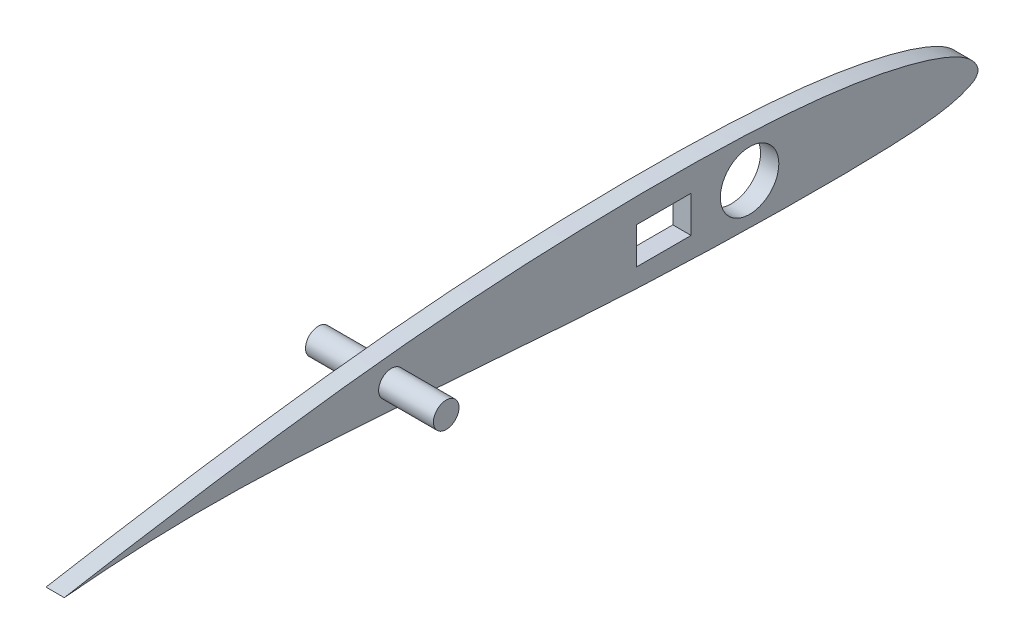
ISO-10303-21;
HEADER;
FILE_DESCRIPTION(('STEP AP214'),'2;1');
FILE_NAME('part.step','',(''),(''),'','','');
FILE_SCHEMA(('AUTOMOTIVE_DESIGN { 1 0 10303 214 1 1 1 1 }'));
ENDSEC;
DATA;
#1=APPLICATION_CONTEXT('core data for automotive mechanical design processes');
#2=APPLICATION_PROTOCOL_DEFINITION('international standard','automotive_design',2000,#1);
#3=PRODUCT_CONTEXT('',#1,'mechanical');
#4=PRODUCT('Part','Part','',(#3));
#5=PRODUCT_RELATED_PRODUCT_CATEGORY('part','',(#4));
#6=PRODUCT_DEFINITION_FORMATION('','',#4);
#7=PRODUCT_DEFINITION_CONTEXT('part definition',#1,'design');
#8=PRODUCT_DEFINITION('design','',#6,#7);
#9=PRODUCT_DEFINITION_SHAPE('','',#8);
#10=(LENGTH_UNIT() NAMED_UNIT(*) SI_UNIT(.MILLI.,.METRE.));
#11=(NAMED_UNIT(*) PLANE_ANGLE_UNIT() SI_UNIT($,.RADIAN.));
#12=(NAMED_UNIT(*) SI_UNIT($,.STERADIAN.) SOLID_ANGLE_UNIT());
#13=UNCERTAINTY_MEASURE_WITH_UNIT(LENGTH_MEASURE(1.E-05),#10,'distance_accuracy_value','');
#14=(GEOMETRIC_REPRESENTATION_CONTEXT(3) GLOBAL_UNCERTAINTY_ASSIGNED_CONTEXT((#13)) GLOBAL_UNIT_ASSIGNED_CONTEXT((#10,
#11,#12)) REPRESENTATION_CONTEXT('',''));
#15=CARTESIAN_POINT('',(0.,0.,0.));
#16=DIRECTION('',(0.,0.,1.));
#17=DIRECTION('',(1.,0.,0.));
#18=AXIS2_PLACEMENT_3D('',#15,#16,#17);
#19=CARTESIAN_POINT('',(5.,1.49711132773622,0.435092083404368));
#20=DIRECTION('',(-1.,0.,0.));
#21=DIRECTION('',(0.,0.,1.));
#22=AXIS2_PLACEMENT_3D('',#19,#20,#21);
#23=PLANE('',#22);
#24=CARTESIAN_POINT('',(5.,6.07732270373844,160.499919709394));
#25=DIRECTION('',(-1.,0.,0.));
#26=DIRECTION('',(0.,0.,1.));
#27=AXIS2_PLACEMENT_3D('',#24,#25,#26);
#28=CIRCLE('',#27,3.49999999999999);
#29=CARTESIAN_POINT('',(5.,6.07732270373844,163.999919709394));
#30=VERTEX_POINT('',#29);
#31=EDGE_CURVE('E102',#30,#30,#28,.T.);
#32=ORIENTED_EDGE('',*,*,#31,.T.);
#33=EDGE_LOOP('',(#32));
#34=FACE_BOUND('',#33,.T.);
#35=CARTESIAN_POINT('',(5.,5.07732270373844,62.4999197093942));
#36=DIRECTION('',(1.,0.,0.));
#37=DIRECTION('',(0.,0.,-1.));
#38=AXIS2_PLACEMENT_3D('',#35,#36,#37);
#39=CIRCLE('',#38,8.);
#40=CARTESIAN_POINT('',(5.,5.07732270373844,54.4999197093942));
#41=VERTEX_POINT('',#40);
#42=EDGE_CURVE('E112',#41,#41,#39,.T.);
#43=ORIENTED_EDGE('',*,*,#42,.F.);
#44=EDGE_LOOP('',(#43));
#45=FACE_BOUND('',#44,.T.);
#46=CARTESIAN_POINT('',(5.,0.,250.));
#47=CARTESIAN_POINT('',(5.,-0.0080427959719715,250.000228293678));
#48=CARTESIAN_POINT('',(5.,0.172375657967406,248.284955515532));
#49=CARTESIAN_POINT('',(5.,0.308690014795419,246.518112419387));
#50=CARTESIAN_POINT('',(5.,0.685693593852336,242.189387343398));
#51=CARTESIAN_POINT('',(5.,1.07410152891603,236.806461263496));
#52=CARTESIAN_POINT('',(5.,1.49731723995003,229.680385951639));
#53=CARTESIAN_POINT('',(5.,1.8232186026768,221.18415869828));
#54=CARTESIAN_POINT('',(5.,1.96762610068065,211.337618207726));
#55=CARTESIAN_POINT('',(5.,1.83322105638369,200.371188527109));
#56=CARTESIAN_POINT('',(5.,1.38960528984164,188.499913622482));
#57=CARTESIAN_POINT('',(5.,0.706014078000893,175.953687417433));
#58=CARTESIAN_POINT('',(5.,-0.160208641561513,162.931424917666));
#59=CARTESIAN_POINT('',(5.,-1.14801632724376,149.615771743617));
#60=CARTESIAN_POINT('',(5.,-2.19092490983926,136.176354994724));
#61=CARTESIAN_POINT('',(5.,-3.21958397917046,122.767140548026));
#62=CARTESIAN_POINT('',(5.,-4.15274312671142,109.520053587455));
#63=CARTESIAN_POINT('',(5.,-4.93856436487493,96.5460959745437));
#64=CARTESIAN_POINT('',(5.,-5.53683070268675,83.9408193016427));
#65=CARTESIAN_POINT('',(5.,-5.94764820461108,71.8018392906514));
#66=CARTESIAN_POINT('',(5.,-6.21845093878312,60.2452560030716));
#67=CARTESIAN_POINT('',(5.,-6.35536975583973,49.3987328907547));
#68=CARTESIAN_POINT('',(5.,-6.38138796281789,39.3972261942655));
#69=CARTESIAN_POINT('',(5.,-6.26504923032313,30.3619348419668));
#70=CARTESIAN_POINT('',(5.,-6.01216491688521,22.4121811031587));
#71=CARTESIAN_POINT('',(5.,-5.59743390072595,15.6262272306516));
#72=CARTESIAN_POINT('',(5.,-4.92870657935606,10.0719075109048));
#73=CARTESIAN_POINT('',(5.,-4.04044698146404,5.69769261214423));
#74=CARTESIAN_POINT('',(5.,-2.8657529844069,2.62532063874475));
#75=CARTESIAN_POINT('',(5.,-1.7115284699546,0.494884225045661));
#76=CARTESIAN_POINT('',(5.,-0.410454230626488,-0.0213125491030087));
#77=CARTESIAN_POINT('',(5.,0.792659826704065,0.0311691995850224));
#78=CARTESIAN_POINT('',(5.,2.30568433693192,0.812599241892923));
#79=CARTESIAN_POINT('',(5.,4.23835242447377,2.72886351673443));
#80=CARTESIAN_POINT('',(5.,6.11817212106947,5.76990724125498));
#81=CARTESIAN_POINT('',(5.,7.91359420170391,9.88094280419771));
#82=CARTESIAN_POINT('',(5.,9.64131817838287,15.0749304677094));
#83=CARTESIAN_POINT('',(5.,11.2838964878058,21.2987522216172));
#84=CARTESIAN_POINT('',(5.,12.7883817585812,28.4971721202648));
#85=CARTESIAN_POINT('',(5.,14.0978349081275,36.6073734062479));
#86=CARTESIAN_POINT('',(5.,15.1594290171638,45.573028440303));
#87=CARTESIAN_POINT('',(5.,15.9609039979753,55.3329100744701));
#88=CARTESIAN_POINT('',(5.,16.4940697383882,65.8165364983871));
#89=CARTESIAN_POINT('',(5.,16.7919897051422,76.9313762604552));
#90=CARTESIAN_POINT('',(5.,16.864754130909,88.5669490281142));
#91=CARTESIAN_POINT('',(5.,16.7267152914356,100.596999885542));
#92=CARTESIAN_POINT('',(5.,16.3833850637257,112.888825982424));
#93=CARTESIAN_POINT('',(5.,15.825573666627,125.31161581915));
#94=CARTESIAN_POINT('',(5.,15.0523318700684,137.743791097076));
#95=CARTESIAN_POINT('',(5.,14.0593390742259,150.072384382085));
#96=CARTESIAN_POINT('',(5.,12.8815869860292,162.191375055682));
#97=CARTESIAN_POINT('',(5.,11.5492803460744,173.989074322246));
#98=CARTESIAN_POINT('',(5.,10.1162497290333,185.35236444642));
#99=CARTESIAN_POINT('',(5.,8.63237912523508,196.163081697706));
#100=CARTESIAN_POINT('',(5.,7.13151388385034,206.300441402258));
#101=CARTESIAN_POINT('',(5.,5.73122176805054,215.560350587015));
#102=CARTESIAN_POINT('',(5.,4.29329512716244,223.97715704258));
#103=CARTESIAN_POINT('',(5.,3.1818088737293,231.363413336396));
#104=CARTESIAN_POINT('',(5.,2.09894241729889,237.746440904332));
#105=CARTESIAN_POINT('',(5.,1.2458619166603,242.622069365861));
#106=CARTESIAN_POINT('',(5.,0.552864946230777,246.64452933247));
#107=CARTESIAN_POINT('',(5.,0.246216764640028,248.328398440367));
#108=CARTESIAN_POINT('',(5.,0.00797737724443801,249.999773563223));
#109=CARTESIAN_POINT('',(5.,0.,250.));
#110=B_SPLINE_CURVE_WITH_KNOTS('',3,(#46,#47,#48,#49,#50,#51,#52,#53,#54,#55,#56,#57,#58,#59,
#60,#61,#62,#63,#64,#65,#66,#67,#68,#69,#70,#71,#72,#73,#74,#75,#76,#77,#78,#79,#80,#81,#82,#83,
#84,#85,#86,#87,#88,#89,#90,#91,#92,#93,#94,#95,#96,#97,#98,#99,#100,#101,#102,#103,#104,#105,
#106,#107,#108,#109),.UNSPECIFIED.,.T.,.F.,(4,1,1,1,1,1,1,1,1,1,1,1,1,1,1,1,1,1,1,1,1,1,1,1,1,1,
1,1,1,1,1,1,1,1,1,1,1,1,1,1,1,1,1,1,1,1,1,1,1,1,1,1,1,1,1,1,1,1,1,1,1,4),(0.,
0.00158888881614516,0.00632921783555629,0.0142024564897436,0.0251728077530557,
0.0391734833267743,0.0560606311759249,0.0755789238487882,0.0973636066296903,0.120926258366677,
0.145825281006277,0.171670911815127,0.198108536705041,0.22479018357162,0.25139057978404,
0.277643490654311,0.303326750051388,0.328257458029316,0.352272548115194,0.375156061746876,
0.396620664402003,0.416422729294005,0.434304420097656,0.450054679859308,0.463465465082325,
0.474478994238096,0.483169222153171,0.489678354497499,0.494104066315722,0.496910015324886,
0.497289784891853,0.501214273282496,0.506457950332762,0.51335695674223,0.522168631834455,
0.53296596992453,0.545689209241574,0.56022077890382,0.57643892310517,0.594258689005965,
0.613600244568652,0.634342385932902,0.656331109263004,0.679351893859712,0.703152302846811,
0.727478208080039,0.7520707394079,0.776691163534608,0.801140183976245,0.825214386971546,
0.848697423570622,0.871352857669295,0.892947448931157,0.913230871058069,0.931955467148994,
0.94834206907442,0.963693004275676,0.976235918239566,0.986320058750392,0.993788799349345,
0.998424034933867,1.),.UNSPECIFIED.);
#111=CARTESIAN_POINT('',(5.,0.,250.));
#112=VERTEX_POINT('',#111);
#113=EDGE_CURVE('E41',#112,#112,#110,.T.);
#114=ORIENTED_EDGE('',*,*,#113,.T.);
#115=EDGE_LOOP('',(#114));
#116=FACE_BOUND('',#115,.T.);
#117=DIRECTION('',(0.,1.,0.));
#118=VECTOR('',#117,1.);
#119=CARTESIAN_POINT('',(5.,10.0773227037384,78.4999197093942));
#120=LINE('',#119,#118);
#121=CARTESIAN_POINT('',(5.,0.0773227037384437,78.4999197093942));
#122=VERTEX_POINT('',#121);
#123=CARTESIAN_POINT('',(5.,10.0773227037384,78.4999197093942));
#124=VERTEX_POINT('',#123);
#125=EDGE_CURVE('E74',#122,#124,#120,.T.);
#126=ORIENTED_EDGE('',*,*,#125,.F.);
#127=DIRECTION('',(0.,0.,-1.));
#128=VECTOR('',#127,1.);
#129=CARTESIAN_POINT('',(5.,0.0773227037384437,78.4999197093942));
#130=LINE('',#129,#128);
#131=CARTESIAN_POINT('',(5.,0.0773227037384437,93.4999197093942));
#132=VERTEX_POINT('',#131);
#133=EDGE_CURVE('E96',#132,#122,#130,.T.);
#134=ORIENTED_EDGE('',*,*,#133,.F.);
#135=DIRECTION('',(0.,-1.,0.));
#136=VECTOR('',#135,1.);
#137=CARTESIAN_POINT('',(5.,10.0773227037384,93.4999197093942));
#138=LINE('',#137,#136);
#139=CARTESIAN_POINT('',(5.,10.0773227037384,93.4999197093942));
#140=VERTEX_POINT('',#139);
#141=EDGE_CURVE('E94',#140,#132,#138,.T.);
#142=ORIENTED_EDGE('',*,*,#141,.F.);
#143=DIRECTION('',(0.,0.,1.));
#144=VECTOR('',#143,1.);
#145=CARTESIAN_POINT('',(5.,10.0773227037384,78.4999197093942));
#146=LINE('',#145,#144);
#147=EDGE_CURVE('E82',#124,#140,#146,.T.);
#148=ORIENTED_EDGE('',*,*,#147,.F.);
#149=EDGE_LOOP('',(#126,#134,#142,#148));
#150=FACE_BOUND('',#149,.T.);
#151=ADVANCED_FACE('F32',(#34,#45,#116,#150),#23,.F.);
#152=CARTESIAN_POINT('',(0.,1.49711132773622,0.435092083404368));
#153=DIRECTION('',(-1.,0.,0.));
#154=DIRECTION('',(0.,0.,1.));
#155=AXIS2_PLACEMENT_3D('',#152,#153,#154);
#156=PLANE('',#155);
#157=CARTESIAN_POINT('',(0.,6.07732270373844,160.499919709394));
#158=DIRECTION('',(-1.,0.,0.));
#159=DIRECTION('',(0.,0.,1.));
#160=AXIS2_PLACEMENT_3D('',#157,#158,#159);
#161=CIRCLE('',#160,3.49999999999999);
#162=CARTESIAN_POINT('',(0.,6.07732270373844,163.999919709394));
#163=VERTEX_POINT('',#162);
#164=EDGE_CURVE('E11',#163,#163,#161,.T.);
#165=ORIENTED_EDGE('',*,*,#164,.F.);
#166=EDGE_LOOP('',(#165));
#167=FACE_BOUND('',#166,.T.);
#168=CARTESIAN_POINT('',(0.,0.,250.));
#169=CARTESIAN_POINT('',(0.,-0.0080427959719715,250.000228293678));
#170=CARTESIAN_POINT('',(0.,0.172375657967406,248.284955515532));
#171=CARTESIAN_POINT('',(0.,0.308690014795419,246.518112419387));
#172=CARTESIAN_POINT('',(0.,0.685693593852336,242.189387343398));
#173=CARTESIAN_POINT('',(0.,1.07410152891603,236.806461263496));
#174=CARTESIAN_POINT('',(0.,1.49731723995003,229.680385951639));
#175=CARTESIAN_POINT('',(0.,1.8232186026768,221.18415869828));
#176=CARTESIAN_POINT('',(0.,1.96762610068065,211.337618207726));
#177=CARTESIAN_POINT('',(0.,1.83322105638369,200.371188527109));
#178=CARTESIAN_POINT('',(0.,1.38960528984164,188.499913622482));
#179=CARTESIAN_POINT('',(0.,0.706014078000893,175.953687417433));
#180=CARTESIAN_POINT('',(0.,-0.160208641561513,162.931424917666));
#181=CARTESIAN_POINT('',(0.,-1.14801632724376,149.615771743617));
#182=CARTESIAN_POINT('',(0.,-2.19092490983926,136.176354994724));
#183=CARTESIAN_POINT('',(0.,-3.21958397917046,122.767140548026));
#184=CARTESIAN_POINT('',(0.,-4.15274312671142,109.520053587455));
#185=CARTESIAN_POINT('',(0.,-4.93856436487493,96.5460959745437));
#186=CARTESIAN_POINT('',(0.,-5.53683070268675,83.9408193016427));
#187=CARTESIAN_POINT('',(0.,-5.94764820461108,71.8018392906514));
#188=CARTESIAN_POINT('',(0.,-6.21845093878312,60.2452560030716));
#189=CARTESIAN_POINT('',(0.,-6.35536975583973,49.3987328907547));
#190=CARTESIAN_POINT('',(0.,-6.38138796281789,39.3972261942655));
#191=CARTESIAN_POINT('',(0.,-6.26504923032313,30.3619348419668));
#192=CARTESIAN_POINT('',(0.,-6.01216491688521,22.4121811031587));
#193=CARTESIAN_POINT('',(0.,-5.59743390072595,15.6262272306516));
#194=CARTESIAN_POINT('',(0.,-4.92870657935606,10.0719075109048));
#195=CARTESIAN_POINT('',(0.,-4.04044698146404,5.69769261214423));
#196=CARTESIAN_POINT('',(0.,-2.8657529844069,2.62532063874475));
#197=CARTESIAN_POINT('',(0.,-1.7115284699546,0.494884225045661));
#198=CARTESIAN_POINT('',(0.,-0.410454230626488,-0.0213125491030087));
#199=CARTESIAN_POINT('',(0.,0.792659826704065,0.0311691995850224));
#200=CARTESIAN_POINT('',(0.,2.30568433693192,0.812599241892923));
#201=CARTESIAN_POINT('',(0.,4.23835242447377,2.72886351673443));
#202=CARTESIAN_POINT('',(0.,6.11817212106947,5.76990724125498));
#203=CARTESIAN_POINT('',(0.,7.91359420170391,9.88094280419771));
#204=CARTESIAN_POINT('',(0.,9.64131817838287,15.0749304677094));
#205=CARTESIAN_POINT('',(0.,11.2838964878058,21.2987522216172));
#206=CARTESIAN_POINT('',(0.,12.7883817585812,28.4971721202648));
#207=CARTESIAN_POINT('',(0.,14.0978349081275,36.6073734062479));
#208=CARTESIAN_POINT('',(0.,15.1594290171638,45.573028440303));
#209=CARTESIAN_POINT('',(0.,15.9609039979753,55.3329100744701));
#210=CARTESIAN_POINT('',(0.,16.4940697383882,65.8165364983871));
#211=CARTESIAN_POINT('',(0.,16.7919897051422,76.9313762604552));
#212=CARTESIAN_POINT('',(0.,16.864754130909,88.5669490281142));
#213=CARTESIAN_POINT('',(0.,16.7267152914356,100.596999885542));
#214=CARTESIAN_POINT('',(0.,16.3833850637257,112.888825982424));
#215=CARTESIAN_POINT('',(0.,15.825573666627,125.31161581915));
#216=CARTESIAN_POINT('',(0.,15.0523318700684,137.743791097076));
#217=CARTESIAN_POINT('',(0.,14.0593390742259,150.072384382085));
#218=CARTESIAN_POINT('',(0.,12.8815869860292,162.191375055682));
#219=CARTESIAN_POINT('',(0.,11.5492803460744,173.989074322246));
#220=CARTESIAN_POINT('',(0.,10.1162497290333,185.35236444642));
#221=CARTESIAN_POINT('',(0.,8.63237912523508,196.163081697706));
#222=CARTESIAN_POINT('',(0.,7.13151388385034,206.300441402258));
#223=CARTESIAN_POINT('',(0.,5.73122176805054,215.560350587015));
#224=CARTESIAN_POINT('',(0.,4.29329512716244,223.97715704258));
#225=CARTESIAN_POINT('',(0.,3.1818088737293,231.363413336396));
#226=CARTESIAN_POINT('',(0.,2.09894241729889,237.746440904332));
#227=CARTESIAN_POINT('',(0.,1.2458619166603,242.622069365861));
#228=CARTESIAN_POINT('',(0.,0.552864946230777,246.64452933247));
#229=CARTESIAN_POINT('',(0.,0.246216764640028,248.328398440367));
#230=CARTESIAN_POINT('',(0.,0.00797737724443801,249.999773563223));
#231=CARTESIAN_POINT('',(0.,0.,250.));
#232=B_SPLINE_CURVE_WITH_KNOTS('',3,(#168,#169,#170,#171,#172,#173,#174,#175,#176,#177,#178,
#179,#180,#181,#182,#183,#184,#185,#186,#187,#188,#189,#190,#191,#192,#193,#194,#195,#196,#197,
#198,#199,#200,#201,#202,#203,#204,#205,#206,#207,#208,#209,#210,#211,#212,#213,#214,#215,#216,
#217,#218,#219,#220,#221,#222,#223,#224,#225,#226,#227,#228,#229,#230,#231),.UNSPECIFIED.,.T.,
.F.,(4,1,1,1,1,1,1,1,1,1,1,1,1,1,1,1,1,1,1,1,1,1,1,1,1,1,1,1,1,1,1,1,1,1,1,1,1,1,1,1,1,1,1,1,1,
1,1,1,1,1,1,1,1,1,1,1,1,1,1,1,1,4),(0.,0.00158888881614516,0.00632921783555629,
0.0142024564897436,0.0251728077530557,0.0391734833267743,0.0560606311759249,0.0755789238487882,
0.0973636066296903,0.120926258366677,0.145825281006277,0.171670911815127,0.198108536705041,
0.22479018357162,0.25139057978404,0.277643490654311,0.303326750051388,0.328257458029316,
0.352272548115194,0.375156061746876,0.396620664402003,0.416422729294005,0.434304420097656,
0.450054679859308,0.463465465082325,0.474478994238096,0.483169222153171,0.489678354497499,
0.494104066315722,0.496910015324886,0.497289784891853,0.501214273282496,0.506457950332762,
0.51335695674223,0.522168631834455,0.53296596992453,0.545689209241574,0.56022077890382,
0.57643892310517,0.594258689005965,0.613600244568652,0.634342385932902,0.656331109263004,
0.679351893859712,0.703152302846811,0.727478208080039,0.7520707394079,0.776691163534608,
0.801140183976245,0.825214386971546,0.848697423570622,0.871352857669295,0.892947448931157,
0.913230871058069,0.931955467148994,0.94834206907442,0.963693004275676,0.976235918239566,
0.986320058750392,0.993788799349345,0.998424034933867,1.),.UNSPECIFIED.);
#233=CARTESIAN_POINT('',(0.,0.,250.));
#234=VERTEX_POINT('',#233);
#235=EDGE_CURVE('E115',#234,#234,#232,.T.);
#236=ORIENTED_EDGE('',*,*,#235,.F.);
#237=EDGE_LOOP('',(#236));
#238=FACE_BOUND('',#237,.T.);
#239=CARTESIAN_POINT('',(0.,5.07732270373844,62.4999197093942));
#240=DIRECTION('',(1.,0.,0.));
#241=DIRECTION('',(0.,0.,-1.));
#242=AXIS2_PLACEMENT_3D('',#239,#240,#241);
#243=CIRCLE('',#242,8.);
#244=CARTESIAN_POINT('',(0.,5.07732270373844,54.4999197093942));
#245=VERTEX_POINT('',#244);
#246=EDGE_CURVE('E90',#245,#245,#243,.T.);
#247=ORIENTED_EDGE('',*,*,#246,.T.);
#248=EDGE_LOOP('',(#247));
#249=FACE_BOUND('',#248,.T.);
#250=DIRECTION('',(0.,0.,-1.));
#251=VECTOR('',#250,1.);
#252=CARTESIAN_POINT('',(0.,0.0773227037384437,78.4999197093942));
#253=LINE('',#252,#251);
#254=CARTESIAN_POINT('',(0.,0.0773227037384437,93.4999197093942));
#255=VERTEX_POINT('',#254);
#256=CARTESIAN_POINT('',(0.,0.0773227037384437,78.4999197093942));
#257=VERTEX_POINT('',#256);
#258=EDGE_CURVE('E83',#255,#257,#253,.T.);
#259=ORIENTED_EDGE('',*,*,#258,.T.);
#260=DIRECTION('',(0.,1.,0.));
#261=VECTOR('',#260,1.);
#262=CARTESIAN_POINT('',(0.,10.0773227037384,78.4999197093942));
#263=LINE('',#262,#261);
#264=CARTESIAN_POINT('',(0.,10.0773227037384,78.4999197093942));
#265=VERTEX_POINT('',#264);
#266=EDGE_CURVE('E56',#257,#265,#263,.T.);
#267=ORIENTED_EDGE('',*,*,#266,.T.);
#268=DIRECTION('',(0.,0.,1.));
#269=VECTOR('',#268,1.);
#270=CARTESIAN_POINT('',(0.,10.0773227037384,78.4999197093942));
#271=LINE('',#270,#269);
#272=CARTESIAN_POINT('',(0.,10.0773227037384,93.4999197093942));
#273=VERTEX_POINT('',#272);
#274=EDGE_CURVE('E89',#265,#273,#271,.T.);
#275=ORIENTED_EDGE('',*,*,#274,.T.);
#276=DIRECTION('',(0.,-1.,0.));
#277=VECTOR('',#276,1.);
#278=CARTESIAN_POINT('',(0.,10.0773227037384,93.4999197093942));
#279=LINE('',#278,#277);
#280=EDGE_CURVE('E104',#273,#255,#279,.T.);
#281=ORIENTED_EDGE('',*,*,#280,.T.);
#282=EDGE_LOOP('',(#259,#267,#275,#281));
#283=FACE_BOUND('',#282,.T.);
#284=ADVANCED_FACE('F133',(#167,#238,#249,#283),#156,.T.);
#285=DIRECTION('',(-1.,0.,0.));
#286=VECTOR('',#285,1.);
#287=SURFACE_OF_LINEAR_EXTRUSION('',#110,#286);
#288=ORIENTED_EDGE('',*,*,#113,.F.);
#289=EDGE_LOOP('',(#288));
#290=FACE_BOUND('',#289,.T.);
#291=ORIENTED_EDGE('',*,*,#235,.T.);
#292=EDGE_LOOP('',(#291));
#293=FACE_BOUND('',#292,.T.);
#294=ADVANCED_FACE('F34',(#290,#293),#287,.F.);
#295=CARTESIAN_POINT('',(5.,5.07732270373844,62.4999197093942));
#296=DIRECTION('',(-1.,0.,0.));
#297=DIRECTION('',(0.,0.,1.));
#298=AXIS2_PLACEMENT_3D('',#295,#296,#297);
#299=CYLINDRICAL_SURFACE('',#298,8.);
#300=ORIENTED_EDGE('',*,*,#42,.T.);
#301=EDGE_LOOP('',(#300));
#302=FACE_BOUND('',#301,.T.);
#303=ORIENTED_EDGE('',*,*,#246,.F.);
#304=EDGE_LOOP('',(#303));
#305=FACE_BOUND('',#304,.T.);
#306=ADVANCED_FACE('F163',(#302,#305),#299,.F.);
#307=CARTESIAN_POINT('',(5.,10.0773227037384,78.4999197093942));
#308=DIRECTION('',(0.,0.,1.));
#309=DIRECTION('',(1.,0.,0.));
#310=AXIS2_PLACEMENT_3D('',#307,#308,#309);
#311=PLANE('',#310);
#312=ORIENTED_EDGE('',*,*,#266,.F.);
#313=DIRECTION('',(-1.,0.,0.));
#314=VECTOR('',#313,1.);
#315=CARTESIAN_POINT('',(5.,0.0773227037384437,78.4999197093942));
#316=LINE('',#315,#314);
#317=EDGE_CURVE('E78',#122,#257,#316,.T.);
#318=ORIENTED_EDGE('',*,*,#317,.F.);
#319=ORIENTED_EDGE('',*,*,#125,.T.);
#320=DIRECTION('',(-1.,0.,0.));
#321=VECTOR('',#320,1.);
#322=CARTESIAN_POINT('',(5.,10.0773227037384,78.4999197093942));
#323=LINE('',#322,#321);
#324=EDGE_CURVE('E77',#124,#265,#323,.T.);
#325=ORIENTED_EDGE('',*,*,#324,.T.);
#326=EDGE_LOOP('',(#312,#318,#319,#325));
#327=FACE_BOUND('',#326,.T.);
#328=ADVANCED_FACE('F76',(#327),#311,.T.);
#329=CARTESIAN_POINT('',(5.,10.0773227037384,78.4999197093942));
#330=DIRECTION('',(0.,-1.,0.));
#331=DIRECTION('',(0.,0.,-1.));
#332=AXIS2_PLACEMENT_3D('',#329,#330,#331);
#333=PLANE('',#332);
#334=ORIENTED_EDGE('',*,*,#274,.F.);
#335=ORIENTED_EDGE('',*,*,#324,.F.);
#336=ORIENTED_EDGE('',*,*,#147,.T.);
#337=DIRECTION('',(-1.,0.,0.));
#338=VECTOR('',#337,1.);
#339=CARTESIAN_POINT('',(5.,10.0773227037384,93.4999197093942));
#340=LINE('',#339,#338);
#341=EDGE_CURVE('E91',#140,#273,#340,.T.);
#342=ORIENTED_EDGE('',*,*,#341,.T.);
#343=EDGE_LOOP('',(#334,#335,#336,#342));
#344=FACE_BOUND('',#343,.T.);
#345=ADVANCED_FACE('F86',(#344),#333,.T.);
#346=CARTESIAN_POINT('',(5.,10.0773227037384,93.4999197093942));
#347=DIRECTION('',(0.,0.,-1.));
#348=DIRECTION('',(-1.,0.,0.));
#349=AXIS2_PLACEMENT_3D('',#346,#347,#348);
#350=PLANE('',#349);
#351=ORIENTED_EDGE('',*,*,#280,.F.);
#352=ORIENTED_EDGE('',*,*,#341,.F.);
#353=ORIENTED_EDGE('',*,*,#141,.T.);
#354=DIRECTION('',(-1.,0.,0.));
#355=VECTOR('',#354,1.);
#356=CARTESIAN_POINT('',(5.,0.0773227037384437,93.4999197093942));
#357=LINE('',#356,#355);
#358=EDGE_CURVE('E48',#132,#255,#357,.T.);
#359=ORIENTED_EDGE('',*,*,#358,.T.);
#360=EDGE_LOOP('',(#351,#352,#353,#359));
#361=FACE_BOUND('',#360,.T.);
#362=ADVANCED_FACE('F143',(#361),#350,.T.);
#363=CARTESIAN_POINT('',(5.,0.0773227037384437,78.4999197093942));
#364=DIRECTION('',(0.,1.,0.));
#365=DIRECTION('',(0.,0.,1.));
#366=AXIS2_PLACEMENT_3D('',#363,#364,#365);
#367=PLANE('',#366);
#368=ORIENTED_EDGE('',*,*,#258,.F.);
#369=ORIENTED_EDGE('',*,*,#358,.F.);
#370=ORIENTED_EDGE('',*,*,#133,.T.);
#371=ORIENTED_EDGE('',*,*,#317,.T.);
#372=EDGE_LOOP('',(#368,#369,#370,#371));
#373=FACE_BOUND('',#372,.T.);
#374=ADVANCED_FACE('F140',(#373),#367,.T.);
#375=CARTESIAN_POINT('',(-15.,6.07732270373844,160.499919709394));
#376=DIRECTION('',(-1.,0.,0.));
#377=DIRECTION('',(0.,0.,1.));
#378=AXIS2_PLACEMENT_3D('',#375,#376,#377);
#379=PLANE('',#378);
#380=CARTESIAN_POINT('',(-15.,6.07732270373844,160.499919709394));
#381=DIRECTION('',(-1.,0.,0.));
#382=DIRECTION('',(0.,0.,1.));
#383=AXIS2_PLACEMENT_3D('',#380,#381,#382);
#384=CIRCLE('',#383,3.49999999999999);
#385=CARTESIAN_POINT('',(-15.,6.07732270373844,163.999919709394));
#386=VERTEX_POINT('',#385);
#387=EDGE_CURVE('E234',#386,#386,#384,.T.);
#388=ORIENTED_EDGE('',*,*,#387,.T.);
#389=EDGE_LOOP('',(#388));
#390=FACE_BOUND('',#389,.T.);
#391=ADVANCED_FACE('F142',(#390),#379,.T.);
#392=CARTESIAN_POINT('',(20.,6.07732270373844,160.499919709394));
#393=DIRECTION('',(-1.,0.,0.));
#394=DIRECTION('',(0.,0.,1.));
#395=AXIS2_PLACEMENT_3D('',#392,#393,#394);
#396=CYLINDRICAL_SURFACE('',#395,3.49999999999999);
#397=ORIENTED_EDGE('',*,*,#164,.T.);
#398=EDGE_LOOP('',(#397));
#399=FACE_BOUND('',#398,.T.);
#400=ORIENTED_EDGE('',*,*,#387,.F.);
#401=EDGE_LOOP('',(#400));
#402=FACE_BOUND('',#401,.T.);
#403=ADVANCED_FACE('F149',(#399,#402),#396,.T.);
#404=CARTESIAN_POINT('',(20.,6.07732270373844,160.499919709394));
#405=DIRECTION('',(-1.,0.,0.));
#406=DIRECTION('',(0.,0.,1.));
#407=AXIS2_PLACEMENT_3D('',#404,#405,#406);
#408=CIRCLE('',#407,3.49999999999999);
#409=CARTESIAN_POINT('',(20.,6.07732270373844,163.999919709394));
#410=VERTEX_POINT('',#409);
#411=EDGE_CURVE('E233',#410,#410,#408,.T.);
#412=ORIENTED_EDGE('',*,*,#411,.T.);
#413=EDGE_LOOP('',(#412));
#414=FACE_BOUND('',#413,.T.);
#415=ORIENTED_EDGE('',*,*,#31,.F.);
#416=EDGE_LOOP('',(#415));
#417=FACE_BOUND('',#416,.T.);
#418=ADVANCED_FACE('F209',(#414,#417),#396,.T.);
#419=CARTESIAN_POINT('',(20.,6.07732270373844,160.499919709394));
#420=DIRECTION('',(-1.,0.,0.));
#421=DIRECTION('',(0.,0.,1.));
#422=AXIS2_PLACEMENT_3D('',#419,#420,#421);
#423=PLANE('',#422);
#424=ORIENTED_EDGE('',*,*,#411,.F.);
#425=EDGE_LOOP('',(#424));
#426=FACE_BOUND('',#425,.T.);
#427=ADVANCED_FACE('F218',(#426),#423,.F.);
#428=CLOSED_SHELL('',(#151,#284,#294,#306,#328,#345,#362,#374,#391,#403,#418,#427));
#429=MANIFOLD_SOLID_BREP('B2',#428);
#430=ADVANCED_BREP_SHAPE_REPRESENTATION('',(#18,#429),#14);
#431=SHAPE_DEFINITION_REPRESENTATION(#9,#430);
ENDSEC;
END-ISO-10303-21;
